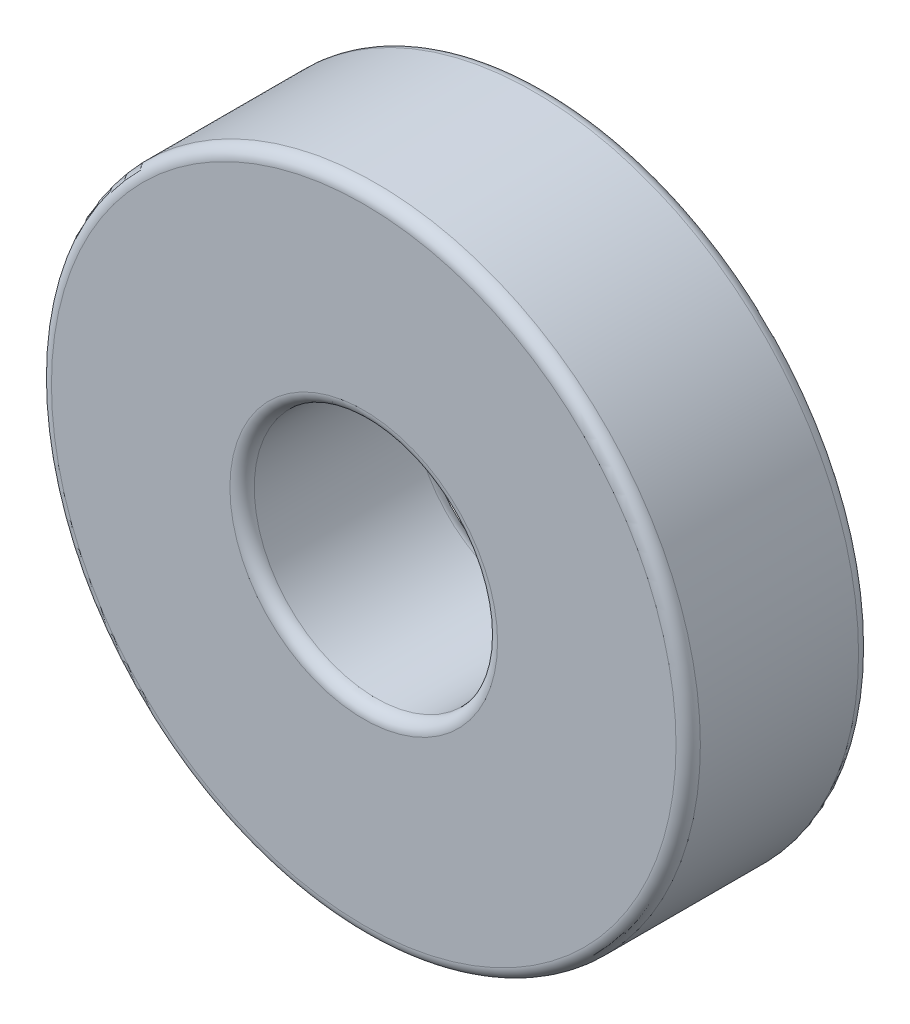
ISO-10303-21;
HEADER;
FILE_DESCRIPTION(('STEP AP214'),'2;1');
FILE_NAME('part.step','',(''),(''),'','','');
FILE_SCHEMA(('AUTOMOTIVE_DESIGN { 1 0 10303 214 1 1 1 1 }'));
ENDSEC;
DATA;
#1=APPLICATION_CONTEXT('core data for automotive mechanical design processes');
#2=APPLICATION_PROTOCOL_DEFINITION('international standard','automotive_design',2000,#1);
#3=PRODUCT_CONTEXT('',#1,'mechanical');
#4=PRODUCT('Part','Part','',(#3));
#5=PRODUCT_RELATED_PRODUCT_CATEGORY('part','',(#4));
#6=PRODUCT_DEFINITION_FORMATION('','',#4);
#7=PRODUCT_DEFINITION_CONTEXT('part definition',#1,'design');
#8=PRODUCT_DEFINITION('design','',#6,#7);
#9=PRODUCT_DEFINITION_SHAPE('','',#8);
#10=(LENGTH_UNIT() NAMED_UNIT(*) SI_UNIT(.MILLI.,.METRE.));
#11=(NAMED_UNIT(*) PLANE_ANGLE_UNIT() SI_UNIT($,.RADIAN.));
#12=(NAMED_UNIT(*) SI_UNIT($,.STERADIAN.) SOLID_ANGLE_UNIT());
#13=UNCERTAINTY_MEASURE_WITH_UNIT(LENGTH_MEASURE(1.E-05),#10,'distance_accuracy_value','');
#14=(GEOMETRIC_REPRESENTATION_CONTEXT(3) GLOBAL_UNCERTAINTY_ASSIGNED_CONTEXT((#13)) GLOBAL_UNIT_ASSIGNED_CONTEXT((#10,
#11,#12)) REPRESENTATION_CONTEXT('',''));
#15=CARTESIAN_POINT('',(0.,0.,0.));
#16=DIRECTION('',(0.,0.,1.));
#17=DIRECTION('',(1.,0.,0.));
#18=AXIS2_PLACEMENT_3D('',#15,#16,#17);
#19=CARTESIAN_POINT('',(0.,0.,8.99999999999998));
#20=DIRECTION('',(0.,0.,1.));
#21=DIRECTION('',(1.,0.,0.));
#22=AXIS2_PLACEMENT_3D('',#19,#20,#21);
#23=PLANE('',#22);
#24=CARTESIAN_POINT('',(0.,0.,8.99999999999998));
#25=DIRECTION('',(0.,0.,1.));
#26=DIRECTION('',(1.,0.,0.));
#27=AXIS2_PLACEMENT_3D('',#24,#25,#26);
#28=CIRCLE('',#27,6.6);
#29=CARTESIAN_POINT('',(6.6,0.,8.99999999999998));
#30=VERTEX_POINT('',#29);
#31=EDGE_CURVE('E46',#30,#30,#28,.F.);
#32=ORIENTED_EDGE('',*,*,#31,.T.);
#33=EDGE_LOOP('',(#32));
#34=FACE_BOUND('',#33,.T.);
#35=CARTESIAN_POINT('',(0.,0.,8.99999999999998));
#36=DIRECTION('',(0.,0.,1.));
#37=DIRECTION('',(1.,0.,0.));
#38=AXIS2_PLACEMENT_3D('',#35,#36,#37);
#39=CIRCLE('',#38,15.4);
#40=CARTESIAN_POINT('',(15.4,0.,8.99999999999998));
#41=VERTEX_POINT('',#40);
#42=EDGE_CURVE('E50',#41,#41,#39,.T.);
#43=ORIENTED_EDGE('',*,*,#42,.T.);
#44=EDGE_LOOP('',(#43));
#45=FACE_BOUND('',#44,.T.);
#46=ADVANCED_FACE('F35',(#34,#45),#23,.T.);
#47=CARTESIAN_POINT('',(0.,0.,0.));
#48=DIRECTION('',(0.,0.,1.));
#49=DIRECTION('',(1.,0.,0.));
#50=AXIS2_PLACEMENT_3D('',#47,#48,#49);
#51=PLANE('',#50);
#52=CARTESIAN_POINT('',(0.,0.,0.));
#53=DIRECTION('',(0.,0.,1.));
#54=DIRECTION('',(1.,0.,0.));
#55=AXIS2_PLACEMENT_3D('',#52,#53,#54);
#56=CIRCLE('',#55,6.6);
#57=CARTESIAN_POINT('',(6.6,0.,0.));
#58=VERTEX_POINT('',#57);
#59=EDGE_CURVE('E61',#58,#58,#56,.T.);
#60=ORIENTED_EDGE('',*,*,#59,.T.);
#61=EDGE_LOOP('',(#60));
#62=FACE_BOUND('',#61,.T.);
#63=CARTESIAN_POINT('',(0.,0.,0.));
#64=DIRECTION('',(0.,0.,1.));
#65=DIRECTION('',(1.,0.,0.));
#66=AXIS2_PLACEMENT_3D('',#63,#64,#65);
#67=CIRCLE('',#66,15.4);
#68=CARTESIAN_POINT('',(15.4,0.,0.));
#69=VERTEX_POINT('',#68);
#70=EDGE_CURVE('E64',#69,#69,#67,.F.);
#71=ORIENTED_EDGE('',*,*,#70,.T.);
#72=EDGE_LOOP('',(#71));
#73=FACE_BOUND('',#72,.T.);
#74=ADVANCED_FACE('F68',(#62,#73),#51,.F.);
#75=CARTESIAN_POINT('',(0.,0.,8.99999999999998));
#76=DIRECTION('',(0.,0.,-1.));
#77=DIRECTION('',(-1.,0.,0.));
#78=AXIS2_PLACEMENT_3D('',#75,#76,#77);
#79=CYLINDRICAL_SURFACE('',#78,16.);
#80=CARTESIAN_POINT('',(0.,0.,0.599999999999989));
#81=DIRECTION('',(0.,0.,1.));
#82=DIRECTION('',(1.,0.,0.));
#83=AXIS2_PLACEMENT_3D('',#80,#81,#82);
#84=CIRCLE('',#83,16.);
#85=CARTESIAN_POINT('',(16.,0.,0.599999999999989));
#86=VERTEX_POINT('',#85);
#87=EDGE_CURVE('E10',#86,#86,#84,.T.);
#88=ORIENTED_EDGE('',*,*,#87,.T.);
#89=EDGE_LOOP('',(#88));
#90=FACE_BOUND('',#89,.T.);
#91=CARTESIAN_POINT('',(0.,0.,8.39999999999999));
#92=DIRECTION('',(0.,0.,1.));
#93=DIRECTION('',(1.,0.,0.));
#94=AXIS2_PLACEMENT_3D('',#91,#92,#93);
#95=CIRCLE('',#94,16.);
#96=CARTESIAN_POINT('',(16.,0.,8.39999999999999));
#97=VERTEX_POINT('',#96);
#98=EDGE_CURVE('E42',#97,#97,#95,.F.);
#99=ORIENTED_EDGE('',*,*,#98,.T.);
#100=EDGE_LOOP('',(#99));
#101=FACE_BOUND('',#100,.T.);
#102=ADVANCED_FACE('F88',(#90,#101),#79,.T.);
#103=CARTESIAN_POINT('',(0.,0.,8.99999999999998));
#104=DIRECTION('',(0.,0.,-1.));
#105=DIRECTION('',(-1.,0.,0.));
#106=AXIS2_PLACEMENT_3D('',#103,#104,#105);
#107=CYLINDRICAL_SURFACE('',#106,6.);
#108=CARTESIAN_POINT('',(0.,0.,0.599999999999989));
#109=DIRECTION('',(0.,0.,1.));
#110=DIRECTION('',(1.,0.,0.));
#111=AXIS2_PLACEMENT_3D('',#108,#109,#110);
#112=CIRCLE('',#111,6.);
#113=CARTESIAN_POINT('',(6.,0.,0.599999999999989));
#114=VERTEX_POINT('',#113);
#115=EDGE_CURVE('E55',#114,#114,#112,.F.);
#116=ORIENTED_EDGE('',*,*,#115,.T.);
#117=EDGE_LOOP('',(#116));
#118=FACE_BOUND('',#117,.T.);
#119=CARTESIAN_POINT('',(0.,0.,8.39999999999999));
#120=DIRECTION('',(0.,0.,1.));
#121=DIRECTION('',(1.,0.,0.));
#122=AXIS2_PLACEMENT_3D('',#119,#120,#121);
#123=CIRCLE('',#122,6.);
#124=CARTESIAN_POINT('',(6.,0.,8.39999999999999));
#125=VERTEX_POINT('',#124);
#126=EDGE_CURVE('E58',#125,#125,#123,.T.);
#127=ORIENTED_EDGE('',*,*,#126,.T.);
#128=EDGE_LOOP('',(#127));
#129=FACE_BOUND('',#128,.T.);
#130=ADVANCED_FACE('F93',(#118,#129),#107,.F.);
#131=CARTESIAN_POINT('',(0.,0.,0.599999999999989));
#132=DIRECTION('',(0.,0.,1.));
#133=DIRECTION('',(1.,0.,0.));
#134=AXIS2_PLACEMENT_3D('',#131,#132,#133);
#135=TOROIDAL_SURFACE('',#134,6.6,0.6);
#136=ORIENTED_EDGE('',*,*,#115,.F.);
#137=EDGE_LOOP('',(#136));
#138=FACE_BOUND('',#137,.T.);
#139=ORIENTED_EDGE('',*,*,#59,.F.);
#140=EDGE_LOOP('',(#139));
#141=FACE_BOUND('',#140,.T.);
#142=ADVANCED_FACE('F79',(#138,#141),#135,.T.);
#143=CARTESIAN_POINT('',(0.,0.,8.39999999999999));
#144=DIRECTION('',(0.,0.,1.));
#145=DIRECTION('',(1.,0.,0.));
#146=AXIS2_PLACEMENT_3D('',#143,#144,#145);
#147=TOROIDAL_SURFACE('',#146,6.6,0.6);
#148=ORIENTED_EDGE('',*,*,#31,.F.);
#149=EDGE_LOOP('',(#148));
#150=FACE_BOUND('',#149,.T.);
#151=ORIENTED_EDGE('',*,*,#126,.F.);
#152=EDGE_LOOP('',(#151));
#153=FACE_BOUND('',#152,.T.);
#154=ADVANCED_FACE('F73',(#150,#153),#147,.T.);
#155=CARTESIAN_POINT('',(0.,0.,0.599999999999989));
#156=DIRECTION('',(0.,0.,1.));
#157=DIRECTION('',(1.,0.,0.));
#158=AXIS2_PLACEMENT_3D('',#155,#156,#157);
#159=TOROIDAL_SURFACE('',#158,15.4,0.6);
#160=ORIENTED_EDGE('',*,*,#70,.F.);
#161=EDGE_LOOP('',(#160));
#162=FACE_BOUND('',#161,.T.);
#163=ORIENTED_EDGE('',*,*,#87,.F.);
#164=EDGE_LOOP('',(#163));
#165=FACE_BOUND('',#164,.T.);
#166=ADVANCED_FACE('F70',(#162,#165),#159,.T.);
#167=CARTESIAN_POINT('',(0.,0.,8.39999999999999));
#168=DIRECTION('',(0.,0.,1.));
#169=DIRECTION('',(1.,0.,0.));
#170=AXIS2_PLACEMENT_3D('',#167,#168,#169);
#171=TOROIDAL_SURFACE('',#170,15.4,0.6);
#172=ORIENTED_EDGE('',*,*,#98,.F.);
#173=EDGE_LOOP('',(#172));
#174=FACE_BOUND('',#173,.T.);
#175=ORIENTED_EDGE('',*,*,#42,.F.);
#176=EDGE_LOOP('',(#175));
#177=FACE_BOUND('',#176,.T.);
#178=ADVANCED_FACE('F37',(#174,#177),#171,.T.);
#179=CLOSED_SHELL('',(#46,#74,#102,#130,#142,#154,#166,#178));
#180=MANIFOLD_SOLID_BREP('B2',#179);
#181=ADVANCED_BREP_SHAPE_REPRESENTATION('',(#18,#180),#14);
#182=SHAPE_DEFINITION_REPRESENTATION(#9,#181);
ENDSEC;
END-ISO-10303-21;
